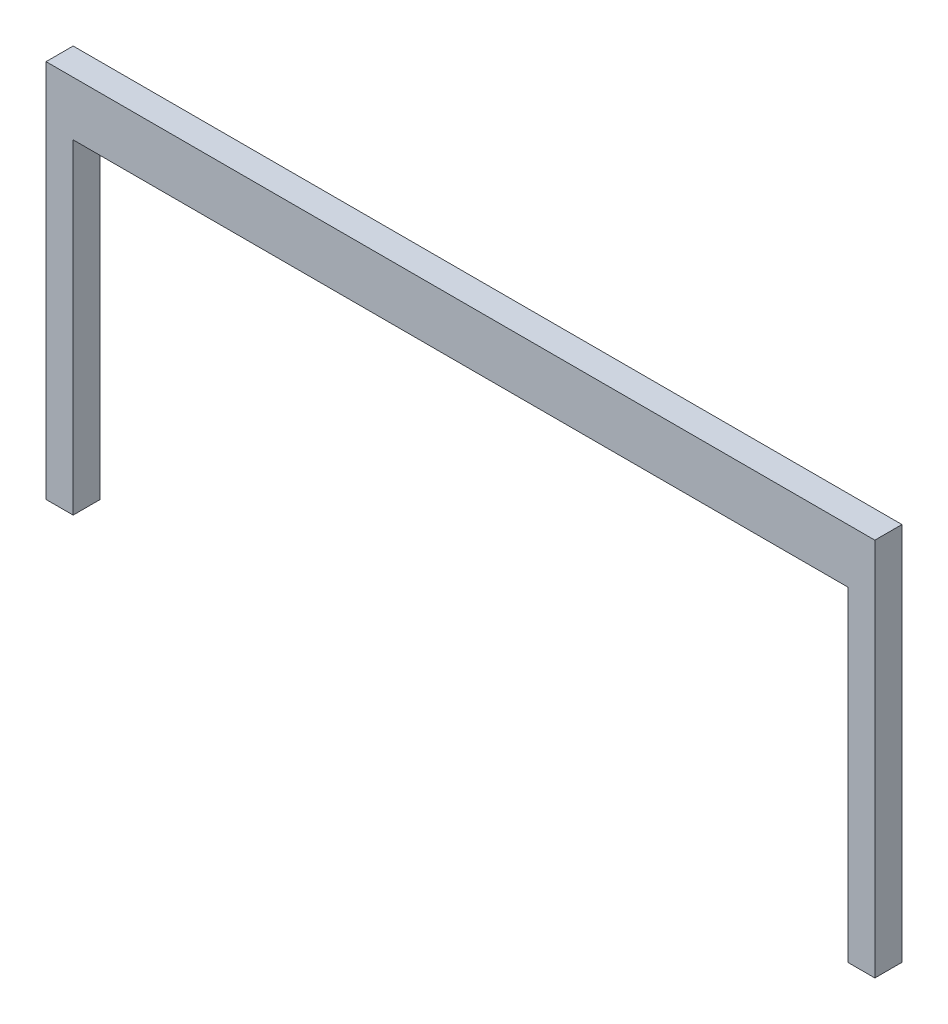
ISO-10303-21;
HEADER;
FILE_DESCRIPTION(('STEP AP214'),'2;1');
FILE_NAME('part.step','',(''),(''),'','','');
FILE_SCHEMA(('AUTOMOTIVE_DESIGN { 1 0 10303 214 1 1 1 1 }'));
ENDSEC;
DATA;
#1=APPLICATION_CONTEXT('core data for automotive mechanical design processes');
#2=APPLICATION_PROTOCOL_DEFINITION('international standard','automotive_design',2000,#1);
#3=PRODUCT_CONTEXT('',#1,'mechanical');
#4=PRODUCT('Part','Part','',(#3));
#5=PRODUCT_RELATED_PRODUCT_CATEGORY('part','',(#4));
#6=PRODUCT_DEFINITION_FORMATION('','',#4);
#7=PRODUCT_DEFINITION_CONTEXT('part definition',#1,'design');
#8=PRODUCT_DEFINITION('design','',#6,#7);
#9=PRODUCT_DEFINITION_SHAPE('','',#8);
#10=(LENGTH_UNIT() NAMED_UNIT(*) SI_UNIT(.MILLI.,.METRE.));
#11=(NAMED_UNIT(*) PLANE_ANGLE_UNIT() SI_UNIT($,.RADIAN.));
#12=(NAMED_UNIT(*) SI_UNIT($,.STERADIAN.) SOLID_ANGLE_UNIT());
#13=UNCERTAINTY_MEASURE_WITH_UNIT(LENGTH_MEASURE(1.E-05),#10,'distance_accuracy_value','');
#14=(GEOMETRIC_REPRESENTATION_CONTEXT(3) GLOBAL_UNCERTAINTY_ASSIGNED_CONTEXT((#13)) GLOBAL_UNIT_ASSIGNED_CONTEXT((#10,
#11,#12)) REPRESENTATION_CONTEXT('',''));
#15=CARTESIAN_POINT('',(0.,0.,0.));
#16=DIRECTION('',(0.,0.,1.));
#17=DIRECTION('',(1.,0.,0.));
#18=AXIS2_PLACEMENT_3D('',#15,#16,#17);
#19=CARTESIAN_POINT('',(-71.5,30.9089096102135,5.));
#20=DIRECTION('',(-1.,0.,0.));
#21=DIRECTION('',(0.,0.,1.));
#22=AXIS2_PLACEMENT_3D('',#19,#20,#21);
#23=PLANE('',#22);
#24=DIRECTION('',(0.,1.,0.));
#25=VECTOR('',#24,1.);
#26=CARTESIAN_POINT('',(-71.5,30.9089096102135,0.));
#27=LINE('',#26,#25);
#28=CARTESIAN_POINT('',(-71.5,-29.0910903897865,0.));
#29=VERTEX_POINT('',#28);
#30=CARTESIAN_POINT('',(-71.5,30.9089096102135,0.));
#31=VERTEX_POINT('',#30);
#32=EDGE_CURVE('E140',#29,#31,#27,.T.);
#33=ORIENTED_EDGE('',*,*,#32,.T.);
#34=DIRECTION('',(0.,0.,-1.));
#35=VECTOR('',#34,1.);
#36=CARTESIAN_POINT('',(-71.5,30.9089096102135,5.));
#37=LINE('',#36,#35);
#38=CARTESIAN_POINT('',(-71.5,30.9089096102135,5.));
#39=VERTEX_POINT('',#38);
#40=EDGE_CURVE('E11',#39,#31,#37,.T.);
#41=ORIENTED_EDGE('',*,*,#40,.F.);
#42=DIRECTION('',(0.,1.,0.));
#43=VECTOR('',#42,1.);
#44=CARTESIAN_POINT('',(-71.5,30.9089096102135,5.));
#45=LINE('',#44,#43);
#46=CARTESIAN_POINT('',(-71.5,-29.0910903897865,5.));
#47=VERTEX_POINT('',#46);
#48=EDGE_CURVE('E162',#47,#39,#45,.T.);
#49=ORIENTED_EDGE('',*,*,#48,.F.);
#50=DIRECTION('',(0.,0.,-1.));
#51=VECTOR('',#50,1.);
#52=CARTESIAN_POINT('',(-71.5,-29.0910903897865,5.));
#53=LINE('',#52,#51);
#54=EDGE_CURVE('E136',#47,#29,#53,.T.);
#55=ORIENTED_EDGE('',*,*,#54,.T.);
#56=EDGE_LOOP('',(#33,#41,#49,#55));
#57=FACE_BOUND('',#56,.T.);
#58=ADVANCED_FACE('F39',(#57),#23,.F.);
#59=CARTESIAN_POINT('',(71.5,30.9089096102136,5.));
#60=DIRECTION('',(0.,1.,0.));
#61=DIRECTION('',(-1.,0.,0.));
#62=AXIS2_PLACEMENT_3D('',#59,#60,#61);
#63=PLANE('',#62);
#64=DIRECTION('',(1.,0.,0.));
#65=VECTOR('',#64,1.);
#66=CARTESIAN_POINT('',(71.5,30.9089096102136,0.));
#67=LINE('',#66,#65);
#68=CARTESIAN_POINT('',(71.5,30.9089096102136,0.));
#69=VERTEX_POINT('',#68);
#70=EDGE_CURVE('E144',#31,#69,#67,.T.);
#71=ORIENTED_EDGE('',*,*,#70,.T.);
#72=DIRECTION('',(0.,0.,-1.));
#73=VECTOR('',#72,1.);
#74=CARTESIAN_POINT('',(71.5,30.9089096102136,5.));
#75=LINE('',#74,#73);
#76=CARTESIAN_POINT('',(71.5,30.9089096102136,5.));
#77=VERTEX_POINT('',#76);
#78=EDGE_CURVE('E48',#77,#69,#75,.T.);
#79=ORIENTED_EDGE('',*,*,#78,.F.);
#80=DIRECTION('',(1.,0.,0.));
#81=VECTOR('',#80,1.);
#82=CARTESIAN_POINT('',(71.5,30.9089096102136,5.));
#83=LINE('',#82,#81);
#84=EDGE_CURVE('E99',#39,#77,#83,.T.);
#85=ORIENTED_EDGE('',*,*,#84,.F.);
#86=ORIENTED_EDGE('',*,*,#40,.T.);
#87=EDGE_LOOP('',(#71,#79,#85,#86));
#88=FACE_BOUND('',#87,.T.);
#89=ADVANCED_FACE('F208',(#88),#63,.F.);
#90=CARTESIAN_POINT('',(71.5,30.9089096102136,5.));
#91=DIRECTION('',(1.,0.,0.));
#92=DIRECTION('',(0.,1.,0.));
#93=AXIS2_PLACEMENT_3D('',#90,#91,#92);
#94=PLANE('',#93);
#95=DIRECTION('',(0.,-1.,0.));
#96=VECTOR('',#95,1.);
#97=CARTESIAN_POINT('',(71.5,30.9089096102136,0.));
#98=LINE('',#97,#96);
#99=CARTESIAN_POINT('',(71.5,-29.0910903897864,0.));
#100=VERTEX_POINT('',#99);
#101=EDGE_CURVE('E147',#69,#100,#98,.T.);
#102=ORIENTED_EDGE('',*,*,#101,.T.);
#103=DIRECTION('',(0.,0.,-1.));
#104=VECTOR('',#103,1.);
#105=CARTESIAN_POINT('',(71.5,-29.0910903897864,5.));
#106=LINE('',#105,#104);
#107=CARTESIAN_POINT('',(71.5,-29.0910903897864,5.));
#108=VERTEX_POINT('',#107);
#109=EDGE_CURVE('E173',#108,#100,#106,.T.);
#110=ORIENTED_EDGE('',*,*,#109,.F.);
#111=DIRECTION('',(0.,-1.,0.));
#112=VECTOR('',#111,1.);
#113=CARTESIAN_POINT('',(71.5,30.9089096102136,5.));
#114=LINE('',#113,#112);
#115=EDGE_CURVE('E183',#77,#108,#114,.T.);
#116=ORIENTED_EDGE('',*,*,#115,.F.);
#117=ORIENTED_EDGE('',*,*,#78,.T.);
#118=EDGE_LOOP('',(#102,#110,#116,#117));
#119=FACE_BOUND('',#118,.T.);
#120=ADVANCED_FACE('F181',(#119),#94,.F.);
#121=CARTESIAN_POINT('',(71.5,-29.0910903897864,5.));
#122=DIRECTION('',(0.,1.,0.));
#123=DIRECTION('',(-1.,0.,0.));
#124=AXIS2_PLACEMENT_3D('',#121,#122,#123);
#125=PLANE('',#124);
#126=DIRECTION('',(1.,0.,0.));
#127=VECTOR('',#126,1.);
#128=CARTESIAN_POINT('',(71.5,-29.0910903897864,0.));
#129=LINE('',#128,#127);
#130=CARTESIAN_POINT('',(76.5,-29.0910903897864,0.));
#131=VERTEX_POINT('',#130);
#132=EDGE_CURVE('E150',#100,#131,#129,.T.);
#133=ORIENTED_EDGE('',*,*,#132,.T.);
#134=DIRECTION('',(0.,0.,-1.));
#135=VECTOR('',#134,1.);
#136=CARTESIAN_POINT('',(76.5,-29.0910903897864,5.));
#137=LINE('',#136,#135);
#138=CARTESIAN_POINT('',(76.5,-29.0910903897864,5.));
#139=VERTEX_POINT('',#138);
#140=EDGE_CURVE('E169',#139,#131,#137,.T.);
#141=ORIENTED_EDGE('',*,*,#140,.F.);
#142=DIRECTION('',(1.,0.,0.));
#143=VECTOR('',#142,1.);
#144=CARTESIAN_POINT('',(71.5,-29.0910903897864,5.));
#145=LINE('',#144,#143);
#146=EDGE_CURVE('E196',#108,#139,#145,.T.);
#147=ORIENTED_EDGE('',*,*,#146,.F.);
#148=ORIENTED_EDGE('',*,*,#109,.T.);
#149=EDGE_LOOP('',(#133,#141,#147,#148));
#150=FACE_BOUND('',#149,.T.);
#151=ADVANCED_FACE('F191',(#150),#125,.F.);
#152=CARTESIAN_POINT('',(76.5,-29.0910903897864,5.));
#153=DIRECTION('',(-1.,0.,0.));
#154=DIRECTION('',(0.,-1.,0.));
#155=AXIS2_PLACEMENT_3D('',#152,#153,#154);
#156=PLANE('',#155);
#157=DIRECTION('',(0.,1.,0.));
#158=VECTOR('',#157,1.);
#159=CARTESIAN_POINT('',(76.5,-29.0910903897864,0.));
#160=LINE('',#159,#158);
#161=CARTESIAN_POINT('',(76.5,40.9089096102136,0.));
#162=VERTEX_POINT('',#161);
#163=EDGE_CURVE('E153',#131,#162,#160,.T.);
#164=ORIENTED_EDGE('',*,*,#163,.T.);
#165=DIRECTION('',(0.,0.,-1.));
#166=VECTOR('',#165,1.);
#167=CARTESIAN_POINT('',(76.5,40.9089096102136,5.));
#168=LINE('',#167,#166);
#169=CARTESIAN_POINT('',(76.5,40.9089096102136,5.));
#170=VERTEX_POINT('',#169);
#171=EDGE_CURVE('E129',#170,#162,#168,.T.);
#172=ORIENTED_EDGE('',*,*,#171,.F.);
#173=DIRECTION('',(0.,1.,0.));
#174=VECTOR('',#173,1.);
#175=CARTESIAN_POINT('',(76.5,-29.0910903897864,5.));
#176=LINE('',#175,#174);
#177=EDGE_CURVE('E118',#139,#170,#176,.T.);
#178=ORIENTED_EDGE('',*,*,#177,.F.);
#179=ORIENTED_EDGE('',*,*,#140,.T.);
#180=EDGE_LOOP('',(#164,#172,#178,#179));
#181=FACE_BOUND('',#180,.T.);
#182=ADVANCED_FACE('F194',(#181),#156,.F.);
#183=CARTESIAN_POINT('',(-76.5,40.9089096102135,5.));
#184=DIRECTION('',(0.,-1.,0.));
#185=DIRECTION('',(1.,0.,0.));
#186=AXIS2_PLACEMENT_3D('',#183,#184,#185);
#187=PLANE('',#186);
#188=DIRECTION('',(-1.,0.,0.));
#189=VECTOR('',#188,1.);
#190=CARTESIAN_POINT('',(-76.5,40.9089096102135,0.));
#191=LINE('',#190,#189);
#192=CARTESIAN_POINT('',(-76.5,40.9089096102135,0.));
#193=VERTEX_POINT('',#192);
#194=EDGE_CURVE('E127',#162,#193,#191,.T.);
#195=ORIENTED_EDGE('',*,*,#194,.T.);
#196=DIRECTION('',(0.,0.,-1.));
#197=VECTOR('',#196,1.);
#198=CARTESIAN_POINT('',(-76.5,40.9089096102135,5.));
#199=LINE('',#198,#197);
#200=CARTESIAN_POINT('',(-76.5,40.9089096102135,5.));
#201=VERTEX_POINT('',#200);
#202=EDGE_CURVE('E124',#201,#193,#199,.T.);
#203=ORIENTED_EDGE('',*,*,#202,.F.);
#204=DIRECTION('',(-1.,0.,0.));
#205=VECTOR('',#204,1.);
#206=CARTESIAN_POINT('',(-76.5,40.9089096102135,5.));
#207=LINE('',#206,#205);
#208=EDGE_CURVE('E112',#170,#201,#207,.T.);
#209=ORIENTED_EDGE('',*,*,#208,.F.);
#210=ORIENTED_EDGE('',*,*,#171,.T.);
#211=EDGE_LOOP('',(#195,#203,#209,#210));
#212=FACE_BOUND('',#211,.T.);
#213=ADVANCED_FACE('F125',(#212),#187,.F.);
#214=CARTESIAN_POINT('',(-76.5,-29.0910903897865,5.));
#215=DIRECTION('',(1.,0.,0.));
#216=DIRECTION('',(0.,0.,-1.));
#217=AXIS2_PLACEMENT_3D('',#214,#215,#216);
#218=PLANE('',#217);
#219=DIRECTION('',(0.,-1.,0.));
#220=VECTOR('',#219,1.);
#221=CARTESIAN_POINT('',(-76.5,-29.0910903897865,0.));
#222=LINE('',#221,#220);
#223=CARTESIAN_POINT('',(-76.5,-29.0910903897865,0.));
#224=VERTEX_POINT('',#223);
#225=EDGE_CURVE('E85',#193,#224,#222,.T.);
#226=ORIENTED_EDGE('',*,*,#225,.T.);
#227=DIRECTION('',(0.,0.,-1.));
#228=VECTOR('',#227,1.);
#229=CARTESIAN_POINT('',(-76.5,-29.0910903897865,5.));
#230=LINE('',#229,#228);
#231=CARTESIAN_POINT('',(-76.5,-29.0910903897865,5.));
#232=VERTEX_POINT('',#231);
#233=EDGE_CURVE('E130',#232,#224,#230,.T.);
#234=ORIENTED_EDGE('',*,*,#233,.F.);
#235=DIRECTION('',(0.,-1.,0.));
#236=VECTOR('',#235,1.);
#237=CARTESIAN_POINT('',(-76.5,-29.0910903897865,5.));
#238=LINE('',#237,#236);
#239=EDGE_CURVE('E116',#201,#232,#238,.T.);
#240=ORIENTED_EDGE('',*,*,#239,.F.);
#241=ORIENTED_EDGE('',*,*,#202,.T.);
#242=EDGE_LOOP('',(#226,#234,#240,#241));
#243=FACE_BOUND('',#242,.T.);
#244=ADVANCED_FACE('F132',(#243),#218,.F.);
#245=CARTESIAN_POINT('',(-71.5,-29.0910903897865,5.));
#246=DIRECTION('',(0.,1.,0.));
#247=DIRECTION('',(-1.,0.,0.));
#248=AXIS2_PLACEMENT_3D('',#245,#246,#247);
#249=PLANE('',#248);
#250=DIRECTION('',(1.,0.,0.));
#251=VECTOR('',#250,1.);
#252=CARTESIAN_POINT('',(-71.5,-29.0910903897865,0.));
#253=LINE('',#252,#251);
#254=EDGE_CURVE('E91',#224,#29,#253,.T.);
#255=ORIENTED_EDGE('',*,*,#254,.T.);
#256=ORIENTED_EDGE('',*,*,#54,.F.);
#257=DIRECTION('',(1.,0.,0.));
#258=VECTOR('',#257,1.);
#259=CARTESIAN_POINT('',(-71.5,-29.0910903897865,5.));
#260=LINE('',#259,#258);
#261=EDGE_CURVE('E56',#232,#47,#260,.T.);
#262=ORIENTED_EDGE('',*,*,#261,.F.);
#263=ORIENTED_EDGE('',*,*,#233,.T.);
#264=EDGE_LOOP('',(#255,#256,#262,#263));
#265=FACE_BOUND('',#264,.T.);
#266=ADVANCED_FACE('F224',(#265),#249,.F.);
#267=CARTESIAN_POINT('',(0.,0.,5.));
#268=DIRECTION('',(0.,0.,-1.));
#269=DIRECTION('',(-1.,0.,0.));
#270=AXIS2_PLACEMENT_3D('',#267,#268,#269);
#271=PLANE('',#270);
#272=ORIENTED_EDGE('',*,*,#48,.T.);
#273=ORIENTED_EDGE('',*,*,#84,.T.);
#274=ORIENTED_EDGE('',*,*,#115,.T.);
#275=ORIENTED_EDGE('',*,*,#146,.T.);
#276=ORIENTED_EDGE('',*,*,#177,.T.);
#277=ORIENTED_EDGE('',*,*,#208,.T.);
#278=ORIENTED_EDGE('',*,*,#239,.T.);
#279=ORIENTED_EDGE('',*,*,#261,.T.);
#280=EDGE_LOOP('',(#272,#273,#274,#275,#276,#277,#278,#279));
#281=FACE_BOUND('',#280,.T.);
#282=ADVANCED_FACE('F114',(#281),#271,.F.);
#283=CARTESIAN_POINT('',(0.,0.,0.));
#284=DIRECTION('',(0.,0.,-1.));
#285=DIRECTION('',(-1.,0.,0.));
#286=AXIS2_PLACEMENT_3D('',#283,#284,#285);
#287=PLANE('',#286);
#288=ORIENTED_EDGE('',*,*,#32,.F.);
#289=ORIENTED_EDGE('',*,*,#254,.F.);
#290=ORIENTED_EDGE('',*,*,#225,.F.);
#291=ORIENTED_EDGE('',*,*,#194,.F.);
#292=ORIENTED_EDGE('',*,*,#163,.F.);
#293=ORIENTED_EDGE('',*,*,#132,.F.);
#294=ORIENTED_EDGE('',*,*,#101,.F.);
#295=ORIENTED_EDGE('',*,*,#70,.F.);
#296=EDGE_LOOP('',(#288,#289,#290,#291,#292,#293,#294,#295));
#297=FACE_BOUND('',#296,.T.);
#298=ADVANCED_FACE('F187',(#297),#287,.T.);
#299=CLOSED_SHELL('',(#58,#89,#120,#151,#182,#213,#244,#266,#282,#298));
#300=MANIFOLD_SOLID_BREP('B2',#299);
#301=ADVANCED_BREP_SHAPE_REPRESENTATION('',(#18,#300),#14);
#302=SHAPE_DEFINITION_REPRESENTATION(#9,#301);
ENDSEC;
END-ISO-10303-21;
